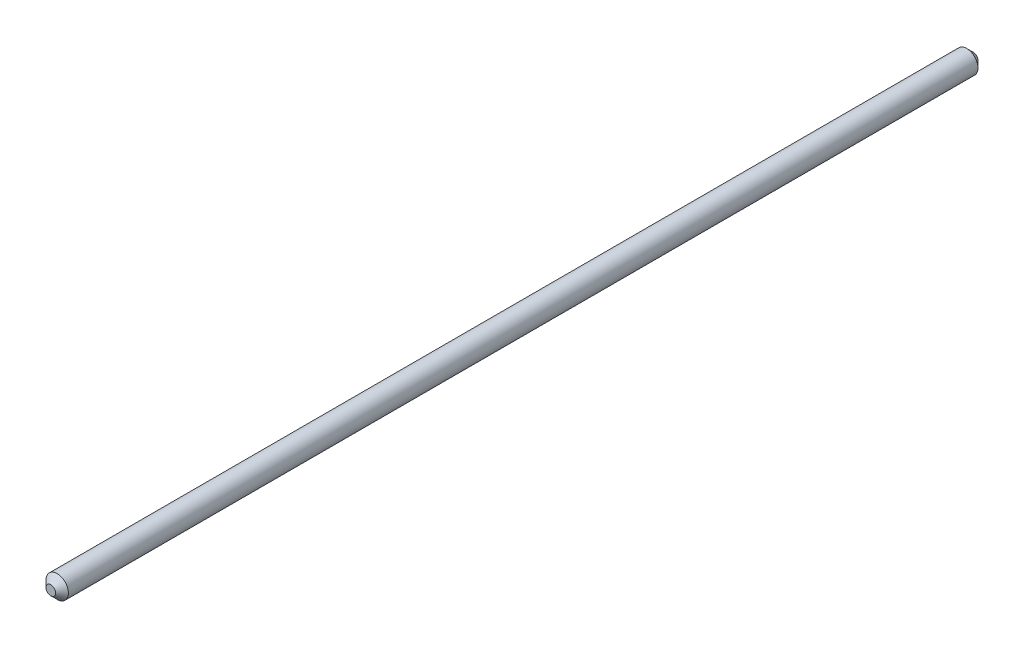
ISO-10303-21;
HEADER;
FILE_DESCRIPTION(('STEP AP214'),'2;1');
FILE_NAME('part.step','',(''),(''),'','','');
FILE_SCHEMA(('AUTOMOTIVE_DESIGN { 1 0 10303 214 1 1 1 1 }'));
ENDSEC;
DATA;
#1=APPLICATION_CONTEXT('core data for automotive mechanical design processes');
#2=APPLICATION_PROTOCOL_DEFINITION('international standard','automotive_design',2000,#1);
#3=PRODUCT_CONTEXT('',#1,'mechanical');
#4=PRODUCT('Part','Part','',(#3));
#5=PRODUCT_RELATED_PRODUCT_CATEGORY('part','',(#4));
#6=PRODUCT_DEFINITION_FORMATION('','',#4);
#7=PRODUCT_DEFINITION_CONTEXT('part definition',#1,'design');
#8=PRODUCT_DEFINITION('design','',#6,#7);
#9=PRODUCT_DEFINITION_SHAPE('','',#8);
#10=(LENGTH_UNIT() NAMED_UNIT(*) SI_UNIT(.MILLI.,.METRE.));
#11=(NAMED_UNIT(*) PLANE_ANGLE_UNIT() SI_UNIT($,.RADIAN.));
#12=(NAMED_UNIT(*) SI_UNIT($,.STERADIAN.) SOLID_ANGLE_UNIT());
#13=UNCERTAINTY_MEASURE_WITH_UNIT(LENGTH_MEASURE(1.E-05),#10,'distance_accuracy_value','');
#14=(GEOMETRIC_REPRESENTATION_CONTEXT(3) GLOBAL_UNCERTAINTY_ASSIGNED_CONTEXT((#13)) GLOBAL_UNIT_ASSIGNED_CONTEXT((#10,
#11,#12)) REPRESENTATION_CONTEXT('',''));
#15=CARTESIAN_POINT('',(0.,0.,0.));
#16=DIRECTION('',(0.,0.,1.));
#17=DIRECTION('',(1.,0.,0.));
#18=AXIS2_PLACEMENT_3D('',#15,#16,#17);
#19=CARTESIAN_POINT('',(0.,0.,162.5));
#20=DIRECTION('',(0.,0.,1.));
#21=DIRECTION('',(1.,0.,0.));
#22=AXIS2_PLACEMENT_3D('',#19,#20,#21);
#23=CYLINDRICAL_SURFACE('',#22,3.95000000000095);
#24=CARTESIAN_POINT('',(0.,0.,160.25));
#25=DIRECTION('',(0.,0.,-1.));
#26=DIRECTION('',(-1.,0.,0.));
#27=AXIS2_PLACEMENT_3D('',#24,#25,#26);
#28=CIRCLE('',#27,3.95000000000095);
#29=CARTESIAN_POINT('',(-3.95000000000095,0.,160.25));
#30=VERTEX_POINT('',#29);
#31=EDGE_CURVE('E45',#30,#30,#28,.T.);
#32=ORIENTED_EDGE('',*,*,#31,.T.);
#33=EDGE_LOOP('',(#32));
#34=FACE_BOUND('',#33,.T.);
#35=CARTESIAN_POINT('',(0.,0.,-160.25));
#36=DIRECTION('',(0.,0.,1.));
#37=DIRECTION('',(1.,0.,0.));
#38=AXIS2_PLACEMENT_3D('',#35,#36,#37);
#39=CIRCLE('',#38,3.95000000000095);
#40=CARTESIAN_POINT('',(3.95000000000094,0.,-160.25));
#41=VERTEX_POINT('',#40);
#42=EDGE_CURVE('E50',#41,#41,#39,.T.);
#43=ORIENTED_EDGE('',*,*,#42,.T.);
#44=EDGE_LOOP('',(#43));
#45=FACE_BOUND('',#44,.T.);
#46=ADVANCED_FACE('F37',(#34,#45),#23,.T.);
#47=CARTESIAN_POINT('',(0.,3.95000000000095,162.5));
#48=DIRECTION('',(0.,0.,-1.));
#49=DIRECTION('',(-1.,0.,0.));
#50=AXIS2_PLACEMENT_3D('',#47,#48,#49);
#51=PLANE('',#50);
#52=CARTESIAN_POINT('',(0.,0.,162.5));
#53=DIRECTION('',(0.,0.,-1.));
#54=DIRECTION('',(-1.,0.,0.));
#55=AXIS2_PLACEMENT_3D('',#52,#53,#54);
#56=CIRCLE('',#55,1.70000000000095);
#57=CARTESIAN_POINT('',(-1.70000000000095,0.,162.5));
#58=VERTEX_POINT('',#57);
#59=EDGE_CURVE('E55',#58,#58,#56,.F.);
#60=ORIENTED_EDGE('',*,*,#59,.T.);
#61=EDGE_LOOP('',(#60));
#62=FACE_BOUND('',#61,.T.);
#63=ADVANCED_FACE('F62',(#62),#51,.F.);
#64=CARTESIAN_POINT('',(0.,0.,-162.5));
#65=DIRECTION('',(0.,0.,1.));
#66=DIRECTION('',(1.,0.,0.));
#67=AXIS2_PLACEMENT_3D('',#64,#65,#66);
#68=PLANE('',#67);
#69=CARTESIAN_POINT('',(0.,0.,-162.5));
#70=DIRECTION('',(0.,0.,1.));
#71=DIRECTION('',(1.,0.,0.));
#72=AXIS2_PLACEMENT_3D('',#69,#70,#71);
#73=CIRCLE('',#72,1.7000000000009);
#74=CARTESIAN_POINT('',(1.70000000000088,0.,-162.5));
#75=VERTEX_POINT('',#74);
#76=EDGE_CURVE('E10',#75,#75,#73,.F.);
#77=ORIENTED_EDGE('',*,*,#76,.T.);
#78=EDGE_LOOP('',(#77));
#79=FACE_BOUND('',#78,.T.);
#80=ADVANCED_FACE('F66',(#79),#68,.F.);
#81=CARTESIAN_POINT('',(0.,0.,162.5));
#82=DIRECTION('',(0.,0.,-1.));
#83=DIRECTION('',(-1.,0.,0.));
#84=AXIS2_PLACEMENT_3D('',#81,#82,#83);
#85=CONICAL_SURFACE('',#84,1.70000000000095,0.785398163397443);
#86=ORIENTED_EDGE('',*,*,#31,.F.);
#87=EDGE_LOOP('',(#86));
#88=FACE_BOUND('',#87,.T.);
#89=ORIENTED_EDGE('',*,*,#59,.F.);
#90=EDGE_LOOP('',(#89));
#91=FACE_BOUND('',#90,.T.);
#92=ADVANCED_FACE('F64',(#88,#91),#85,.T.);
#93=CARTESIAN_POINT('',(0.,0.,-160.25));
#94=DIRECTION('',(0.,0.,1.));
#95=DIRECTION('',(1.,0.,0.));
#96=AXIS2_PLACEMENT_3D('',#93,#94,#95);
#97=CONICAL_SURFACE('',#96,3.95000000000095,0.785398163397443);
#98=CARTESIAN_POINT('',(1.70000000000088,0.,-162.5));
#99=CARTESIAN_POINT('',(1.72343750000088,0.,-162.4765625));
#100=CARTESIAN_POINT('',(1.74687500000088,0.,-162.453125));
#101=CARTESIAN_POINT('',(1.79375000000088,0.,-162.40625));
#102=CARTESIAN_POINT('',(1.81718750000088,0.,-162.3828125));
#103=CARTESIAN_POINT('',(1.86406250000089,0.,-162.3359375));
#104=CARTESIAN_POINT('',(1.88750000000089,0.,-162.3125));
#105=CARTESIAN_POINT('',(1.93437500000089,0.,-162.265625));
#106=CARTESIAN_POINT('',(1.95781250000089,0.,-162.2421875));
#107=CARTESIAN_POINT('',(2.00468750000089,0.,-162.1953125));
#108=CARTESIAN_POINT('',(2.02812500000089,0.,-162.171875));
#109=CARTESIAN_POINT('',(2.07500000000089,0.,-162.125));
#110=CARTESIAN_POINT('',(2.09843750000089,0.,-162.1015625));
#111=CARTESIAN_POINT('',(2.14531250000089,0.,-162.0546875));
#112=CARTESIAN_POINT('',(2.16875000000089,0.,-162.03125));
#113=CARTESIAN_POINT('',(2.21562500000089,0.,-161.984375));
#114=CARTESIAN_POINT('',(2.2390625000009,0.,-161.9609375));
#115=CARTESIAN_POINT('',(2.2859375000009,0.,-161.9140625));
#116=CARTESIAN_POINT('',(2.3093750000009,0.,-161.890625));
#117=CARTESIAN_POINT('',(2.3562500000009,0.,-161.84375));
#118=CARTESIAN_POINT('',(2.3796875000009,0.,-161.8203125));
#119=CARTESIAN_POINT('',(2.4265625000009,0.,-161.7734375));
#120=CARTESIAN_POINT('',(2.4500000000009,0.,-161.75));
#121=CARTESIAN_POINT('',(2.4968750000009,0.,-161.703125));
#122=CARTESIAN_POINT('',(2.5203125000009,0.,-161.6796875));
#123=CARTESIAN_POINT('',(2.5671875000009,0.,-161.6328125));
#124=CARTESIAN_POINT('',(2.5906250000009,0.,-161.609375));
#125=CARTESIAN_POINT('',(2.63750000000091,0.,-161.5625));
#126=CARTESIAN_POINT('',(2.66093750000091,0.,-161.5390625));
#127=CARTESIAN_POINT('',(2.70781250000091,0.,-161.4921875));
#128=CARTESIAN_POINT('',(2.73125000000091,0.,-161.46875));
#129=CARTESIAN_POINT('',(2.77812500000091,0.,-161.421875));
#130=CARTESIAN_POINT('',(2.80156250000091,0.,-161.3984375));
#131=CARTESIAN_POINT('',(2.84843750000091,0.,-161.3515625));
#132=CARTESIAN_POINT('',(2.87187500000091,0.,-161.328125));
#133=CARTESIAN_POINT('',(2.91875000000091,0.,-161.28125));
#134=CARTESIAN_POINT('',(2.94218750000091,0.,-161.2578125));
#135=CARTESIAN_POINT('',(2.98906250000092,0.,-161.2109375));
#136=CARTESIAN_POINT('',(3.01250000000092,0.,-161.1875));
#137=CARTESIAN_POINT('',(3.05937500000092,0.,-161.140625));
#138=CARTESIAN_POINT('',(3.08281250000092,0.,-161.1171875));
#139=CARTESIAN_POINT('',(3.12968750000092,0.,-161.0703125));
#140=CARTESIAN_POINT('',(3.15312500000092,0.,-161.046875));
#141=CARTESIAN_POINT('',(3.20000000000092,0.,-161.));
#142=CARTESIAN_POINT('',(3.22343750000092,0.,-160.9765625));
#143=CARTESIAN_POINT('',(3.27031250000092,0.,-160.9296875));
#144=CARTESIAN_POINT('',(3.29375000000092,0.,-160.90625));
#145=CARTESIAN_POINT('',(3.34062500000092,0.,-160.859375));
#146=CARTESIAN_POINT('',(3.36406250000092,0.,-160.8359375));
#147=CARTESIAN_POINT('',(3.41093750000093,0.,-160.7890625));
#148=CARTESIAN_POINT('',(3.43437500000093,0.,-160.765625));
#149=CARTESIAN_POINT('',(3.48125000000093,0.,-160.71875));
#150=CARTESIAN_POINT('',(3.50468750000093,0.,-160.6953125));
#151=CARTESIAN_POINT('',(3.55156250000093,0.,-160.6484375));
#152=CARTESIAN_POINT('',(3.57500000000093,0.,-160.625));
#153=CARTESIAN_POINT('',(3.62187500000093,0.,-160.578125));
#154=CARTESIAN_POINT('',(3.64531250000093,0.,-160.5546875));
#155=CARTESIAN_POINT('',(3.69218750000093,0.,-160.5078125));
#156=CARTESIAN_POINT('',(3.71562500000093,0.,-160.484375));
#157=CARTESIAN_POINT('',(3.76250000000094,0.,-160.4375));
#158=CARTESIAN_POINT('',(3.78593750000094,0.,-160.4140625));
#159=CARTESIAN_POINT('',(3.83281250000094,0.,-160.3671875));
#160=CARTESIAN_POINT('',(3.85625000000094,0.,-160.34375));
#161=CARTESIAN_POINT('',(3.90312500000094,0.,-160.296875));
#162=CARTESIAN_POINT('',(3.92656250000094,0.,-160.2734375));
#163=CARTESIAN_POINT('',(3.95000000000094,0.,-160.25));
#164=B_SPLINE_CURVE_WITH_KNOTS('',3,(#98,#99,#100,#101,#102,#103,#104,#105,#106,#107,#108,#109,
#110,#111,#112,#113,#114,#115,#116,#117,#118,#119,#120,#121,#122,#123,#124,#125,#126,#127,#128,
#129,#130,#131,#132,#133,#134,#135,#136,#137,#138,#139,#140,#141,#142,#143,#144,#145,#146,#147,
#148,#149,#150,#151,#152,#153,#154,#155,#156,#157,#158,#159,#160,#161,#162,#163),.UNSPECIFIED.,
.F.,.F.,(4,2,2,2,2,2,2,2,2,2,2,2,2,2,2,2,2,2,2,2,2,2,2,2,2,2,2,2,2,2,2,2,4),(0.,
0.0994368911043617,0.198873782208723,0.298310673313085,0.397747564417446,0.497184455521807,
0.596621346626169,0.69605823773053,0.795495128834892,0.894932019939253,0.994368911043614,
1.09380580214798,1.19324269325234,1.2926795843567,1.39211647546106,1.49155336656542,
1.59099025766978,1.69042714877414,1.78986403987851,1.88930093098287,1.98873782208723,
2.08817471319159,2.18761160429595,2.28704849540031,2.38648538650467,2.48592227760904,
2.5853591687134,2.68479605981776,2.78423295092214,2.8836698420265,2.98310673313086,
3.08254362423522,3.18198051533959),.UNSPECIFIED.);
#165=EDGE_CURVE('BSEAM39',#75,#41,#164,.T.);
#166=ORIENTED_EDGE('',*,*,#76,.F.);
#167=ORIENTED_EDGE('',*,*,#42,.F.);
#168=ORIENTED_EDGE('',*,*,#165,.T.);
#169=ORIENTED_EDGE('',*,*,#165,.F.);
#170=EDGE_LOOP('',(#166,#168,#167,#169));
#171=FACE_BOUND('',#170,.T.);
#172=ADVANCED_FACE('F39',(#171),#97,.T.);
#173=CLOSED_SHELL('',(#46,#63,#80,#92,#172));
#174=MANIFOLD_SOLID_BREP('B2',#173);
#175=ADVANCED_BREP_SHAPE_REPRESENTATION('',(#18,#174),#14);
#176=SHAPE_DEFINITION_REPRESENTATION(#9,#175);
ENDSEC;
END-ISO-10303-21;
